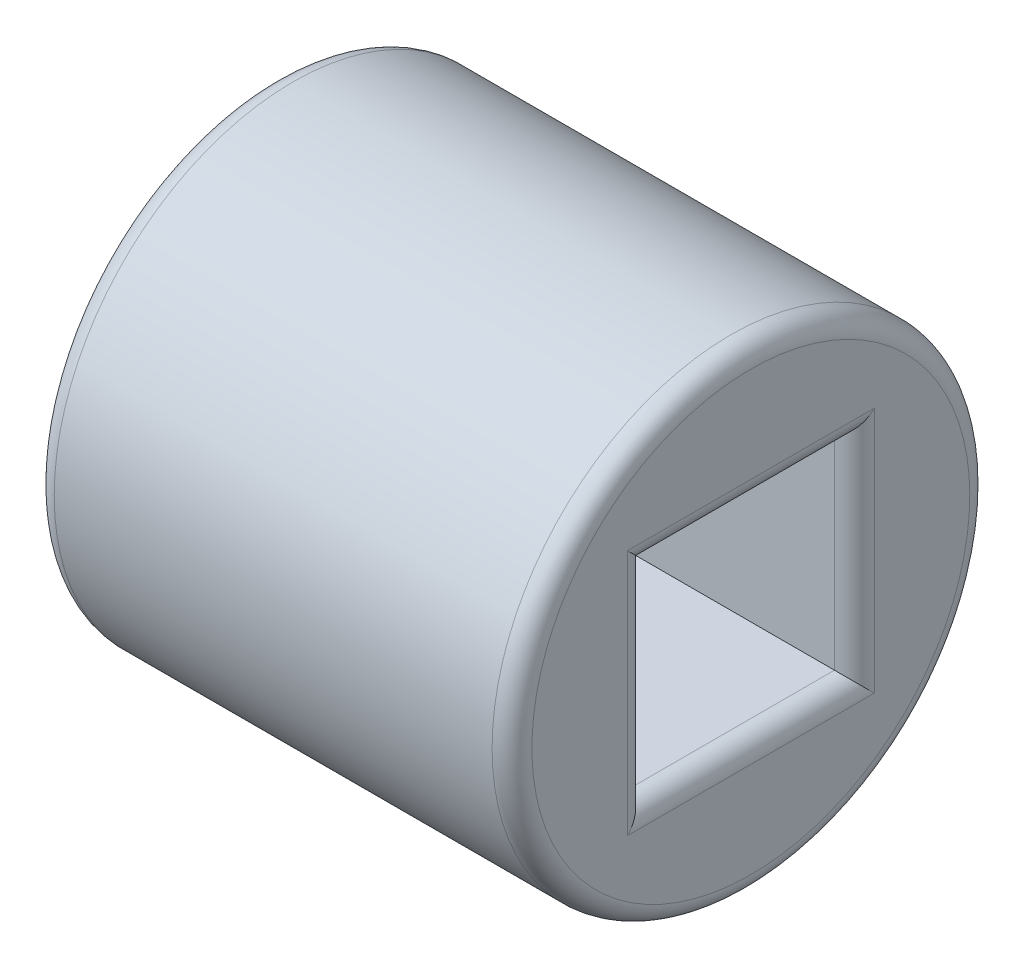
ISO-10303-21;
HEADER;
FILE_DESCRIPTION(('STEP AP214'),'2;1');
FILE_NAME('part.step','',(''),(''),'','','');
FILE_SCHEMA(('AUTOMOTIVE_DESIGN { 1 0 10303 214 1 1 1 1 }'));
ENDSEC;
DATA;
#1=APPLICATION_CONTEXT('core data for automotive mechanical design processes');
#2=APPLICATION_PROTOCOL_DEFINITION('international standard','automotive_design',2000,#1);
#3=PRODUCT_CONTEXT('',#1,'mechanical');
#4=PRODUCT('Part','Part','',(#3));
#5=PRODUCT_RELATED_PRODUCT_CATEGORY('part','',(#4));
#6=PRODUCT_DEFINITION_FORMATION('','',#4);
#7=PRODUCT_DEFINITION_CONTEXT('part definition',#1,'design');
#8=PRODUCT_DEFINITION('design','',#6,#7);
#9=PRODUCT_DEFINITION_SHAPE('','',#8);
#10=(LENGTH_UNIT() NAMED_UNIT(*) SI_UNIT(.MILLI.,.METRE.));
#11=(NAMED_UNIT(*) PLANE_ANGLE_UNIT() SI_UNIT($,.RADIAN.));
#12=(NAMED_UNIT(*) SI_UNIT($,.STERADIAN.) SOLID_ANGLE_UNIT());
#13=UNCERTAINTY_MEASURE_WITH_UNIT(LENGTH_MEASURE(1.E-05),#10,'distance_accuracy_value','');
#14=(GEOMETRIC_REPRESENTATION_CONTEXT(3) GLOBAL_UNCERTAINTY_ASSIGNED_CONTEXT((#13)) GLOBAL_UNIT_ASSIGNED_CONTEXT((#10,
#11,#12)) REPRESENTATION_CONTEXT('',''));
#15=CARTESIAN_POINT('',(0.,0.,0.));
#16=DIRECTION('',(0.,0.,1.));
#17=DIRECTION('',(1.,0.,0.));
#18=AXIS2_PLACEMENT_3D('',#15,#16,#17);
#19=CARTESIAN_POINT('',(15.24,0.,0.));
#20=DIRECTION('',(1.,0.,0.));
#21=DIRECTION('',(0.,0.,-1.));
#22=AXIS2_PLACEMENT_3D('',#19,#20,#21);
#23=PLANE('',#22);
#24=DIRECTION('',(0.,0.,-1.));
#25=VECTOR('',#24,1.);
#26=CARTESIAN_POINT('',(15.24,-3.937,0.));
#27=LINE('',#26,#25);
#28=CARTESIAN_POINT('',(15.24,-3.937,-3.937));
#29=VERTEX_POINT('',#28);
#30=CARTESIAN_POINT('',(15.24,-3.937,3.937));
#31=VERTEX_POINT('',#30);
#32=EDGE_CURVE('E46',#29,#31,#27,.F.);
#33=ORIENTED_EDGE('',*,*,#32,.T.);
#34=DIRECTION('',(0.,-1.,0.));
#35=VECTOR('',#34,1.);
#36=CARTESIAN_POINT('',(15.24,0.,3.937));
#37=LINE('',#36,#35);
#38=CARTESIAN_POINT('',(15.24,3.937,3.937));
#39=VERTEX_POINT('',#38);
#40=EDGE_CURVE('E11',#31,#39,#37,.F.);
#41=ORIENTED_EDGE('',*,*,#40,.T.);
#42=DIRECTION('',(0.,0.,1.));
#43=VECTOR('',#42,1.);
#44=CARTESIAN_POINT('',(15.24,3.937,0.));
#45=LINE('',#44,#43);
#46=CARTESIAN_POINT('',(15.24,3.937,-3.937));
#47=VERTEX_POINT('',#46);
#48=EDGE_CURVE('E158',#39,#47,#45,.F.);
#49=ORIENTED_EDGE('',*,*,#48,.T.);
#50=DIRECTION('',(0.,1.,0.));
#51=VECTOR('',#50,1.);
#52=CARTESIAN_POINT('',(15.24,0.,-3.937));
#53=LINE('',#52,#51);
#54=EDGE_CURVE('E57',#47,#29,#53,.F.);
#55=ORIENTED_EDGE('',*,*,#54,.T.);
#56=EDGE_LOOP('',(#33,#41,#49,#55));
#57=FACE_BOUND('',#56,.T.);
#58=CARTESIAN_POINT('',(15.24,0.,0.));
#59=DIRECTION('',(1.,0.,0.));
#60=DIRECTION('',(0.,0.,-1.));
#61=AXIS2_PLACEMENT_3D('',#58,#59,#60);
#62=CIRCLE('',#61,6.985);
#63=CARTESIAN_POINT('',(15.24,0.,-6.985));
#64=VERTEX_POINT('',#63);
#65=EDGE_CURVE('E155',#64,#64,#62,.T.);
#66=ORIENTED_EDGE('',*,*,#65,.T.);
#67=EDGE_LOOP('',(#66));
#68=FACE_BOUND('',#67,.T.);
#69=ADVANCED_FACE('F37',(#57,#68),#23,.T.);
#70=CARTESIAN_POINT('',(0.,0.,0.));
#71=DIRECTION('',(1.,0.,0.));
#72=DIRECTION('',(0.,0.,-1.));
#73=AXIS2_PLACEMENT_3D('',#70,#71,#72);
#74=PLANE('',#73);
#75=DIRECTION('',(0.,-1.,0.));
#76=VECTOR('',#75,1.);
#77=CARTESIAN_POINT('',(0.,-3.302,3.937));
#78=LINE('',#77,#76);
#79=CARTESIAN_POINT('',(0.,3.937,3.937));
#80=VERTEX_POINT('',#79);
#81=CARTESIAN_POINT('',(0.,-3.937,3.937));
#82=VERTEX_POINT('',#81);
#83=EDGE_CURVE('E127',#80,#82,#78,.T.);
#84=ORIENTED_EDGE('',*,*,#83,.T.);
#85=DIRECTION('',(0.,0.,-1.));
#86=VECTOR('',#85,1.);
#87=CARTESIAN_POINT('',(0.,-3.937,-3.302));
#88=LINE('',#87,#86);
#89=CARTESIAN_POINT('',(0.,-3.937,-3.937));
#90=VERTEX_POINT('',#89);
#91=EDGE_CURVE('E107',#82,#90,#88,.T.);
#92=ORIENTED_EDGE('',*,*,#91,.T.);
#93=DIRECTION('',(0.,1.,0.));
#94=VECTOR('',#93,1.);
#95=CARTESIAN_POINT('',(0.,3.302,-3.937));
#96=LINE('',#95,#94);
#97=CARTESIAN_POINT('',(0.,3.937,-3.937));
#98=VERTEX_POINT('',#97);
#99=EDGE_CURVE('E115',#90,#98,#96,.T.);
#100=ORIENTED_EDGE('',*,*,#99,.T.);
#101=DIRECTION('',(0.,0.,1.));
#102=VECTOR('',#101,1.);
#103=CARTESIAN_POINT('',(0.,3.937,3.302));
#104=LINE('',#103,#102);
#105=EDGE_CURVE('E121',#98,#80,#104,.T.);
#106=ORIENTED_EDGE('',*,*,#105,.T.);
#107=EDGE_LOOP('',(#84,#92,#100,#106));
#108=FACE_BOUND('',#107,.T.);
#109=CARTESIAN_POINT('',(0.,0.,0.));
#110=DIRECTION('',(1.,0.,0.));
#111=DIRECTION('',(0.,0.,-1.));
#112=AXIS2_PLACEMENT_3D('',#109,#110,#111);
#113=CIRCLE('',#112,6.985);
#114=CARTESIAN_POINT('',(0.,0.,-6.985));
#115=VERTEX_POINT('',#114);
#116=EDGE_CURVE('E122',#115,#115,#113,.F.);
#117=ORIENTED_EDGE('',*,*,#116,.T.);
#118=EDGE_LOOP('',(#117));
#119=FACE_BOUND('',#118,.T.);
#120=ADVANCED_FACE('F124',(#108,#119),#74,.F.);
#121=CARTESIAN_POINT('',(15.24,0.,0.));
#122=DIRECTION('',(-1.,0.,0.));
#123=DIRECTION('',(0.,0.,1.));
#124=AXIS2_PLACEMENT_3D('',#121,#122,#123);
#125=CYLINDRICAL_SURFACE('',#124,7.62);
#126=CARTESIAN_POINT('',(0.635,0.,0.));
#127=DIRECTION('',(1.,0.,0.));
#128=DIRECTION('',(0.,0.,-1.));
#129=AXIS2_PLACEMENT_3D('',#126,#127,#128);
#130=CIRCLE('',#129,7.62);
#131=CARTESIAN_POINT('',(0.635,0.,7.62));
#132=VERTEX_POINT('',#131);
#133=EDGE_CURVE('E152',#132,#132,#130,.T.);
#134=CARTESIAN_POINT('',(14.605,0.,0.));
#135=DIRECTION('',(1.,0.,0.));
#136=DIRECTION('',(0.,0.,-1.));
#137=AXIS2_PLACEMENT_3D('',#134,#135,#136);
#138=CIRCLE('',#137,7.62);
#139=CARTESIAN_POINT('',(14.605,0.,7.62));
#140=VERTEX_POINT('',#139);
#141=EDGE_CURVE('E149',#140,#140,#138,.F.);
#142=CARTESIAN_POINT('',(0.635,0.,7.62));
#143=CARTESIAN_POINT('',(0.780520833333333,0.,7.62));
#144=CARTESIAN_POINT('',(0.926041666666666,0.,7.62));
#145=CARTESIAN_POINT('',(1.21708333333333,0.,7.62));
#146=CARTESIAN_POINT('',(1.36260416666667,0.,7.62));
#147=CARTESIAN_POINT('',(1.65364583333333,0.,7.62));
#148=CARTESIAN_POINT('',(1.79916666666667,0.,7.62));
#149=CARTESIAN_POINT('',(2.09020833333333,0.,7.62));
#150=CARTESIAN_POINT('',(2.23572916666667,0.,7.62));
#151=CARTESIAN_POINT('',(2.52677083333333,0.,7.62));
#152=CARTESIAN_POINT('',(2.67229166666667,0.,7.62));
#153=CARTESIAN_POINT('',(2.96333333333333,0.,7.62));
#154=CARTESIAN_POINT('',(3.10885416666667,0.,7.62));
#155=CARTESIAN_POINT('',(3.39989583333333,0.,7.62));
#156=CARTESIAN_POINT('',(3.54541666666667,0.,7.62));
#157=CARTESIAN_POINT('',(3.83645833333333,0.,7.62));
#158=CARTESIAN_POINT('',(3.98197916666667,0.,7.62));
#159=CARTESIAN_POINT('',(4.27302083333333,0.,7.62));
#160=CARTESIAN_POINT('',(4.41854166666667,0.,7.62));
#161=CARTESIAN_POINT('',(4.70958333333333,0.,7.62));
#162=CARTESIAN_POINT('',(4.85510416666667,0.,7.62));
#163=CARTESIAN_POINT('',(5.14614583333334,0.,7.62));
#164=CARTESIAN_POINT('',(5.29166666666667,0.,7.62));
#165=CARTESIAN_POINT('',(5.58270833333333,0.,7.62));
#166=CARTESIAN_POINT('',(5.72822916666667,0.,7.62));
#167=CARTESIAN_POINT('',(6.01927083333333,0.,7.62));
#168=CARTESIAN_POINT('',(6.16479166666667,0.,7.62));
#169=CARTESIAN_POINT('',(6.45583333333334,0.,7.62));
#170=CARTESIAN_POINT('',(6.60135416666667,0.,7.62));
#171=CARTESIAN_POINT('',(6.89239583333333,0.,7.62));
#172=CARTESIAN_POINT('',(7.03791666666667,0.,7.62));
#173=CARTESIAN_POINT('',(7.32895833333333,0.,7.62));
#174=CARTESIAN_POINT('',(7.47447916666667,0.,7.62));
#175=CARTESIAN_POINT('',(7.76552083333333,0.,7.62));
#176=CARTESIAN_POINT('',(7.91104166666667,0.,7.62));
#177=CARTESIAN_POINT('',(8.20208333333333,0.,7.62));
#178=CARTESIAN_POINT('',(8.34760416666667,0.,7.62));
#179=CARTESIAN_POINT('',(8.63864583333334,0.,7.62));
#180=CARTESIAN_POINT('',(8.78416666666667,0.,7.62));
#181=CARTESIAN_POINT('',(9.07520833333334,0.,7.62));
#182=CARTESIAN_POINT('',(9.22072916666667,0.,7.62));
#183=CARTESIAN_POINT('',(9.51177083333334,0.,7.62));
#184=CARTESIAN_POINT('',(9.65729166666667,0.,7.62));
#185=CARTESIAN_POINT('',(9.94833333333334,0.,7.62));
#186=CARTESIAN_POINT('',(10.0938541666667,0.,7.62));
#187=CARTESIAN_POINT('',(10.3848958333333,0.,7.62));
#188=CARTESIAN_POINT('',(10.5304166666667,0.,7.62));
#189=CARTESIAN_POINT('',(10.8214583333333,0.,7.62));
#190=CARTESIAN_POINT('',(10.9669791666667,0.,7.62));
#191=CARTESIAN_POINT('',(11.2580208333333,0.,7.62));
#192=CARTESIAN_POINT('',(11.4035416666667,0.,7.62));
#193=CARTESIAN_POINT('',(11.6945833333333,0.,7.62));
#194=CARTESIAN_POINT('',(11.8401041666667,0.,7.62));
#195=CARTESIAN_POINT('',(12.1311458333333,0.,7.62));
#196=CARTESIAN_POINT('',(12.2766666666667,0.,7.62));
#197=CARTESIAN_POINT('',(12.5677083333333,0.,7.62));
#198=CARTESIAN_POINT('',(12.7132291666667,0.,7.62));
#199=CARTESIAN_POINT('',(13.0042708333333,0.,7.62));
#200=CARTESIAN_POINT('',(13.1497916666667,0.,7.62));
#201=CARTESIAN_POINT('',(13.4408333333333,0.,7.62));
#202=CARTESIAN_POINT('',(13.5863541666667,0.,7.62));
#203=CARTESIAN_POINT('',(13.8773958333333,0.,7.62));
#204=CARTESIAN_POINT('',(14.0229166666667,0.,7.62));
#205=CARTESIAN_POINT('',(14.3139583333333,0.,7.62));
#206=CARTESIAN_POINT('',(14.4594791666667,0.,7.62));
#207=CARTESIAN_POINT('',(14.605,0.,7.62));
#208=B_SPLINE_CURVE_WITH_KNOTS('',3,(#142,#143,#144,#145,#146,#147,#148,#149,#150,#151,#152,
#153,#154,#155,#156,#157,#158,#159,#160,#161,#162,#163,#164,#165,#166,#167,#168,#169,#170,#171,
#172,#173,#174,#175,#176,#177,#178,#179,#180,#181,#182,#183,#184,#185,#186,#187,#188,#189,#190,
#191,#192,#193,#194,#195,#196,#197,#198,#199,#200,#201,#202,#203,#204,#205,#206,#207),
.UNSPECIFIED.,.F.,.F.,(4,2,2,2,2,2,2,2,2,2,2,2,2,2,2,2,2,2,2,2,2,2,2,2,2,2,2,2,2,2,2,2,4),(0.,
0.436562499999999,0.873125000000001,1.3096875,1.74625,2.1828125,2.619375,3.0559375,3.4925,
3.9290625,4.365625,4.8021875,5.23875,5.6753125,6.111875,6.5484375,6.985,7.4215625,7.858125,
8.2946875,8.73125,9.1678125,9.604375,10.0409375,10.4775,10.9140625,11.350625,11.7871875,
12.22375,12.6603125,13.096875,13.5334375,13.97),.UNSPECIFIED.);
#209=EDGE_CURVE('BSEAM203',#132,#140,#208,.T.);
#210=ORIENTED_EDGE('',*,*,#133,.T.);
#211=ORIENTED_EDGE('',*,*,#141,.T.);
#212=ORIENTED_EDGE('',*,*,#209,.T.);
#213=ORIENTED_EDGE('',*,*,#209,.F.);
#214=EDGE_LOOP('',(#210,#212,#211,#213));
#215=FACE_BOUND('',#214,.T.);
#216=ADVANCED_FACE('F203',(#215),#125,.T.);
#217=CARTESIAN_POINT('',(15.24,3.302,-3.302));
#218=DIRECTION('',(0.,0.,1.));
#219=DIRECTION('',(0.,-1.,0.));
#220=AXIS2_PLACEMENT_3D('',#217,#218,#219);
#221=PLANE('',#220);
#222=DIRECTION('',(-1.,0.,0.));
#223=VECTOR('',#222,1.);
#224=CARTESIAN_POINT('',(15.24,3.302,-3.302));
#225=LINE('',#224,#223);
#226=CARTESIAN_POINT('',(14.605,3.302,-3.302));
#227=VERTEX_POINT('',#226);
#228=CARTESIAN_POINT('',(0.635000000000004,3.302,-3.302));
#229=VERTEX_POINT('',#228);
#230=EDGE_CURVE('E386',#227,#229,#225,.T.);
#231=ORIENTED_EDGE('',*,*,#230,.T.);
#232=DIRECTION('',(0.,1.,0.));
#233=VECTOR('',#232,1.);
#234=CARTESIAN_POINT('',(0.635,-3.302,-3.302));
#235=LINE('',#234,#233);
#236=CARTESIAN_POINT('',(0.635000000000004,-3.302,-3.302));
#237=VERTEX_POINT('',#236);
#238=EDGE_CURVE('E147',#229,#237,#235,.F.);
#239=ORIENTED_EDGE('',*,*,#238,.T.);
#240=DIRECTION('',(-1.,0.,0.));
#241=VECTOR('',#240,1.);
#242=CARTESIAN_POINT('',(15.24,-3.302,-3.302));
#243=LINE('',#242,#241);
#244=CARTESIAN_POINT('',(14.605,-3.302,-3.302));
#245=VERTEX_POINT('',#244);
#246=EDGE_CURVE('E167',#245,#237,#243,.T.);
#247=ORIENTED_EDGE('',*,*,#246,.F.);
#248=DIRECTION('',(0.,1.,0.));
#249=VECTOR('',#248,1.);
#250=CARTESIAN_POINT('',(14.605,3.302,-3.302));
#251=LINE('',#250,#249);
#252=EDGE_CURVE('E145',#245,#227,#251,.T.);
#253=ORIENTED_EDGE('',*,*,#252,.T.);
#254=EDGE_LOOP('',(#231,#239,#247,#253));
#255=FACE_BOUND('',#254,.T.);
#256=ADVANCED_FACE('F205',(#255),#221,.T.);
#257=CARTESIAN_POINT('',(15.24,3.302,3.302));
#258=DIRECTION('',(0.,-1.,0.));
#259=DIRECTION('',(0.,0.,-1.));
#260=AXIS2_PLACEMENT_3D('',#257,#258,#259);
#261=PLANE('',#260);
#262=DIRECTION('',(-1.,0.,0.));
#263=VECTOR('',#262,1.);
#264=CARTESIAN_POINT('',(15.24,3.302,3.302));
#265=LINE('',#264,#263);
#266=CARTESIAN_POINT('',(14.605,3.302,3.302));
#267=VERTEX_POINT('',#266);
#268=CARTESIAN_POINT('',(0.635000000000004,3.302,3.302));
#269=VERTEX_POINT('',#268);
#270=EDGE_CURVE('E382',#267,#269,#265,.T.);
#271=ORIENTED_EDGE('',*,*,#270,.T.);
#272=DIRECTION('',(0.,0.,1.));
#273=VECTOR('',#272,1.);
#274=CARTESIAN_POINT('',(0.635,3.302,-3.302));
#275=LINE('',#274,#273);
#276=EDGE_CURVE('E143',#269,#229,#275,.F.);
#277=ORIENTED_EDGE('',*,*,#276,.T.);
#278=ORIENTED_EDGE('',*,*,#230,.F.);
#279=DIRECTION('',(0.,0.,1.));
#280=VECTOR('',#279,1.);
#281=CARTESIAN_POINT('',(14.605,3.302,3.302));
#282=LINE('',#281,#280);
#283=EDGE_CURVE('E141',#227,#267,#282,.T.);
#284=ORIENTED_EDGE('',*,*,#283,.T.);
#285=EDGE_LOOP('',(#271,#277,#278,#284));
#286=FACE_BOUND('',#285,.T.);
#287=ADVANCED_FACE('F212',(#286),#261,.T.);
#288=CARTESIAN_POINT('',(15.24,3.302,3.302));
#289=DIRECTION('',(0.,0.,-1.));
#290=DIRECTION('',(0.,1.,0.));
#291=AXIS2_PLACEMENT_3D('',#288,#289,#290);
#292=PLANE('',#291);
#293=DIRECTION('',(-1.,0.,0.));
#294=VECTOR('',#293,1.);
#295=CARTESIAN_POINT('',(15.24,-3.302,3.302));
#296=LINE('',#295,#294);
#297=CARTESIAN_POINT('',(14.605,-3.302,3.302));
#298=VERTEX_POINT('',#297);
#299=CARTESIAN_POINT('',(0.635000000000004,-3.302,3.302));
#300=VERTEX_POINT('',#299);
#301=EDGE_CURVE('E387',#298,#300,#296,.T.);
#302=ORIENTED_EDGE('',*,*,#301,.T.);
#303=DIRECTION('',(0.,-1.,0.));
#304=VECTOR('',#303,1.);
#305=CARTESIAN_POINT('',(0.635,3.302,3.302));
#306=LINE('',#305,#304);
#307=EDGE_CURVE('E139',#300,#269,#306,.F.);
#308=ORIENTED_EDGE('',*,*,#307,.T.);
#309=ORIENTED_EDGE('',*,*,#270,.F.);
#310=DIRECTION('',(0.,-1.,0.));
#311=VECTOR('',#310,1.);
#312=CARTESIAN_POINT('',(14.605,3.302,3.302));
#313=LINE('',#312,#311);
#314=EDGE_CURVE('E136',#267,#298,#313,.T.);
#315=ORIENTED_EDGE('',*,*,#314,.T.);
#316=EDGE_LOOP('',(#302,#308,#309,#315));
#317=FACE_BOUND('',#316,.T.);
#318=ADVANCED_FACE('F312',(#317),#292,.T.);
#319=CARTESIAN_POINT('',(15.24,-3.302,3.302));
#320=DIRECTION('',(0.,1.,0.));
#321=DIRECTION('',(0.,0.,1.));
#322=AXIS2_PLACEMENT_3D('',#319,#320,#321);
#323=PLANE('',#322);
#324=ORIENTED_EDGE('',*,*,#246,.T.);
#325=DIRECTION('',(0.,0.,-1.));
#326=VECTOR('',#325,1.);
#327=CARTESIAN_POINT('',(0.635,-3.302,3.302));
#328=LINE('',#327,#326);
#329=EDGE_CURVE('E109',#237,#300,#328,.F.);
#330=ORIENTED_EDGE('',*,*,#329,.T.);
#331=ORIENTED_EDGE('',*,*,#301,.F.);
#332=DIRECTION('',(0.,0.,-1.));
#333=VECTOR('',#332,1.);
#334=CARTESIAN_POINT('',(14.605,-3.302,3.302));
#335=LINE('',#334,#333);
#336=EDGE_CURVE('E129',#298,#245,#335,.T.);
#337=ORIENTED_EDGE('',*,*,#336,.T.);
#338=EDGE_LOOP('',(#324,#330,#331,#337));
#339=FACE_BOUND('',#338,.T.);
#340=ADVANCED_FACE('F229',(#339),#323,.T.);
#341=CARTESIAN_POINT('',(0.635,3.937,0.));
#342=DIRECTION('',(0.,0.,-1.));
#343=DIRECTION('',(-1.,0.,0.));
#344=AXIS2_PLACEMENT_3D('',#341,#342,#343);
#345=CYLINDRICAL_SURFACE('',#344,0.635);
#346=CARTESIAN_POINT('',(0.635,3.937,-3.937));
#347=DIRECTION('',(0.,-0.707106781186547,-0.707106781186548));
#348=DIRECTION('',(0.,0.707106781186548,-0.707106781186547));
#349=AXIS2_PLACEMENT_3D('',#346,#347,#348);
#350=ELLIPSE('',#349,0.898025612106915,0.635);
#351=EDGE_CURVE('E118',#229,#98,#350,.T.);
#352=ORIENTED_EDGE('',*,*,#351,.F.);
#353=ORIENTED_EDGE('',*,*,#276,.F.);
#354=CARTESIAN_POINT('',(0.635,3.937,3.937));
#355=DIRECTION('',(0.,0.707106781186548,-0.707106781186547));
#356=DIRECTION('',(0.,0.707106781186547,0.707106781186548));
#357=AXIS2_PLACEMENT_3D('',#354,#355,#356);
#358=ELLIPSE('',#357,0.898025612106915,0.635);
#359=EDGE_CURVE('E164',#80,#269,#358,.F.);
#360=ORIENTED_EDGE('',*,*,#359,.F.);
#361=ORIENTED_EDGE('',*,*,#105,.F.);
#362=EDGE_LOOP('',(#352,#353,#360,#361));
#363=FACE_BOUND('',#362,.T.);
#364=ADVANCED_FACE('F225',(#363),#345,.T.);
#365=CARTESIAN_POINT('',(0.635,0.,3.937));
#366=DIRECTION('',(0.,1.,0.));
#367=DIRECTION('',(0.,0.,1.));
#368=AXIS2_PLACEMENT_3D('',#365,#366,#367);
#369=CYLINDRICAL_SURFACE('',#368,0.635);
#370=ORIENTED_EDGE('',*,*,#359,.T.);
#371=ORIENTED_EDGE('',*,*,#307,.F.);
#372=CARTESIAN_POINT('',(0.635,-3.937,3.937));
#373=DIRECTION('',(0.,0.707106781186547,0.707106781186548));
#374=DIRECTION('',(0.,-0.707106781186548,0.707106781186547));
#375=AXIS2_PLACEMENT_3D('',#372,#373,#374);
#376=ELLIPSE('',#375,0.898025612106915,0.635);
#377=EDGE_CURVE('E112',#82,#300,#376,.F.);
#378=ORIENTED_EDGE('',*,*,#377,.F.);
#379=ORIENTED_EDGE('',*,*,#83,.F.);
#380=EDGE_LOOP('',(#370,#371,#378,#379));
#381=FACE_BOUND('',#380,.T.);
#382=ADVANCED_FACE('F222',(#381),#369,.T.);
#383=CARTESIAN_POINT('',(0.635,0.,-3.937));
#384=DIRECTION('',(0.,-1.,0.));
#385=DIRECTION('',(0.,0.,-1.));
#386=AXIS2_PLACEMENT_3D('',#383,#384,#385);
#387=CYLINDRICAL_SURFACE('',#386,0.635);
#388=ORIENTED_EDGE('',*,*,#351,.T.);
#389=ORIENTED_EDGE('',*,*,#99,.F.);
#390=CARTESIAN_POINT('',(0.635,-3.937,-3.937));
#391=DIRECTION('',(0.,-0.707106781186548,0.707106781186547));
#392=DIRECTION('',(0.,0.707106781186547,0.707106781186548));
#393=AXIS2_PLACEMENT_3D('',#390,#391,#392);
#394=ELLIPSE('',#393,0.898025612106915,0.635);
#395=EDGE_CURVE('E103',#237,#90,#394,.T.);
#396=ORIENTED_EDGE('',*,*,#395,.F.);
#397=ORIENTED_EDGE('',*,*,#238,.F.);
#398=EDGE_LOOP('',(#388,#389,#396,#397));
#399=FACE_BOUND('',#398,.T.);
#400=ADVANCED_FACE('F116',(#399),#387,.T.);
#401=CARTESIAN_POINT('',(0.635,-3.937,0.));
#402=DIRECTION('',(0.,0.,1.));
#403=DIRECTION('',(1.,0.,0.));
#404=AXIS2_PLACEMENT_3D('',#401,#402,#403);
#405=CYLINDRICAL_SURFACE('',#404,0.635);
#406=ORIENTED_EDGE('',*,*,#377,.T.);
#407=ORIENTED_EDGE('',*,*,#329,.F.);
#408=ORIENTED_EDGE('',*,*,#395,.T.);
#409=ORIENTED_EDGE('',*,*,#91,.F.);
#410=EDGE_LOOP('',(#406,#407,#408,#409));
#411=FACE_BOUND('',#410,.T.);
#412=ADVANCED_FACE('F105',(#411),#405,.T.);
#413=CARTESIAN_POINT('',(0.635,0.,0.));
#414=DIRECTION('',(1.,0.,0.));
#415=DIRECTION('',(0.,0.,-1.));
#416=AXIS2_PLACEMENT_3D('',#413,#414,#415);
#417=TOROIDAL_SURFACE('',#416,6.985,0.635);
#418=ORIENTED_EDGE('',*,*,#116,.F.);
#419=EDGE_LOOP('',(#418));
#420=FACE_BOUND('',#419,.T.);
#421=ORIENTED_EDGE('',*,*,#133,.F.);
#422=EDGE_LOOP('',(#421));
#423=FACE_BOUND('',#422,.T.);
#424=ADVANCED_FACE('F219',(#420,#423),#417,.T.);
#425=CARTESIAN_POINT('',(14.605,3.302,-3.937));
#426=DIRECTION('',(0.,1.,0.));
#427=DIRECTION('',(0.,0.,1.));
#428=AXIS2_PLACEMENT_3D('',#425,#426,#427);
#429=CYLINDRICAL_SURFACE('',#428,0.635);
#430=CARTESIAN_POINT('',(14.605,-3.937,-3.937));
#431=DIRECTION('',(0.,0.707106781186548,-0.707106781186547));
#432=DIRECTION('',(0.,-0.707106781186547,-0.707106781186548));
#433=AXIS2_PLACEMENT_3D('',#430,#431,#432);
#434=ELLIPSE('',#433,0.898025612106915,0.635);
#435=EDGE_CURVE('E171',#29,#245,#434,.F.);
#436=ORIENTED_EDGE('',*,*,#435,.F.);
#437=ORIENTED_EDGE('',*,*,#54,.F.);
#438=CARTESIAN_POINT('',(14.605,3.937,-3.937));
#439=DIRECTION('',(0.,0.707106781186547,0.707106781186548));
#440=DIRECTION('',(0.,0.707106781186548,-0.707106781186547));
#441=AXIS2_PLACEMENT_3D('',#438,#439,#440);
#442=ELLIPSE('',#441,0.898025612106915,0.635);
#443=EDGE_CURVE('E41',#227,#47,#442,.T.);
#444=ORIENTED_EDGE('',*,*,#443,.F.);
#445=ORIENTED_EDGE('',*,*,#252,.F.);
#446=EDGE_LOOP('',(#436,#437,#444,#445));
#447=FACE_BOUND('',#446,.T.);
#448=ADVANCED_FACE('F184',(#447),#429,.T.);
#449=CARTESIAN_POINT('',(14.605,3.937,3.302));
#450=DIRECTION('',(0.,0.,1.));
#451=DIRECTION('',(1.,0.,0.));
#452=AXIS2_PLACEMENT_3D('',#449,#450,#451);
#453=CYLINDRICAL_SURFACE('',#452,0.635);
#454=ORIENTED_EDGE('',*,*,#443,.T.);
#455=ORIENTED_EDGE('',*,*,#48,.F.);
#456=CARTESIAN_POINT('',(14.605,3.937,3.937));
#457=DIRECTION('',(0.,-0.707106781186548,0.707106781186547));
#458=DIRECTION('',(0.,-0.707106781186547,-0.707106781186548));
#459=AXIS2_PLACEMENT_3D('',#456,#457,#458);
#460=ELLIPSE('',#459,0.898025612106915,0.635);
#461=EDGE_CURVE('E170',#267,#39,#460,.T.);
#462=ORIENTED_EDGE('',*,*,#461,.F.);
#463=ORIENTED_EDGE('',*,*,#283,.F.);
#464=EDGE_LOOP('',(#454,#455,#462,#463));
#465=FACE_BOUND('',#464,.T.);
#466=ADVANCED_FACE('F180',(#465),#453,.T.);
#467=CARTESIAN_POINT('',(14.605,-3.937,3.302));
#468=DIRECTION('',(0.,0.,-1.));
#469=DIRECTION('',(-1.,0.,0.));
#470=AXIS2_PLACEMENT_3D('',#467,#468,#469);
#471=CYLINDRICAL_SURFACE('',#470,0.635);
#472=ORIENTED_EDGE('',*,*,#435,.T.);
#473=ORIENTED_EDGE('',*,*,#336,.F.);
#474=CARTESIAN_POINT('',(14.605,-3.937,3.937));
#475=DIRECTION('',(0.,-0.707106781186547,-0.707106781186548));
#476=DIRECTION('',(0.,-0.707106781186548,0.707106781186547));
#477=AXIS2_PLACEMENT_3D('',#474,#475,#476);
#478=ELLIPSE('',#477,0.898025612106915,0.635);
#479=EDGE_CURVE('E168',#31,#298,#478,.F.);
#480=ORIENTED_EDGE('',*,*,#479,.F.);
#481=ORIENTED_EDGE('',*,*,#32,.F.);
#482=EDGE_LOOP('',(#472,#473,#480,#481));
#483=FACE_BOUND('',#482,.T.);
#484=ADVANCED_FACE('F186',(#483),#471,.T.);
#485=CARTESIAN_POINT('',(14.605,3.302,3.937));
#486=DIRECTION('',(0.,-1.,0.));
#487=DIRECTION('',(0.,0.,-1.));
#488=AXIS2_PLACEMENT_3D('',#485,#486,#487);
#489=CYLINDRICAL_SURFACE('',#488,0.635);
#490=ORIENTED_EDGE('',*,*,#461,.T.);
#491=ORIENTED_EDGE('',*,*,#40,.F.);
#492=ORIENTED_EDGE('',*,*,#479,.T.);
#493=ORIENTED_EDGE('',*,*,#314,.F.);
#494=EDGE_LOOP('',(#490,#491,#492,#493));
#495=FACE_BOUND('',#494,.T.);
#496=ADVANCED_FACE('F189',(#495),#489,.T.);
#497=CARTESIAN_POINT('',(14.605,0.,0.));
#498=DIRECTION('',(1.,0.,0.));
#499=DIRECTION('',(0.,0.,-1.));
#500=AXIS2_PLACEMENT_3D('',#497,#498,#499);
#501=TOROIDAL_SURFACE('',#500,6.985,0.635);
#502=ORIENTED_EDGE('',*,*,#141,.F.);
#503=EDGE_LOOP('',(#502));
#504=FACE_BOUND('',#503,.T.);
#505=ORIENTED_EDGE('',*,*,#65,.F.);
#506=EDGE_LOOP('',(#505));
#507=FACE_BOUND('',#506,.T.);
#508=ADVANCED_FACE('F39',(#504,#507),#501,.T.);
#509=CLOSED_SHELL('',(#69,#120,#216,#256,#287,#318,#340,#364,#382,#400,#412,#424,#448,#466,#484,
#496,#508));
#510=MANIFOLD_SOLID_BREP('B2',#509);
#511=ADVANCED_BREP_SHAPE_REPRESENTATION('',(#18,#510),#14);
#512=SHAPE_DEFINITION_REPRESENTATION(#9,#511);
ENDSEC;
END-ISO-10303-21;
